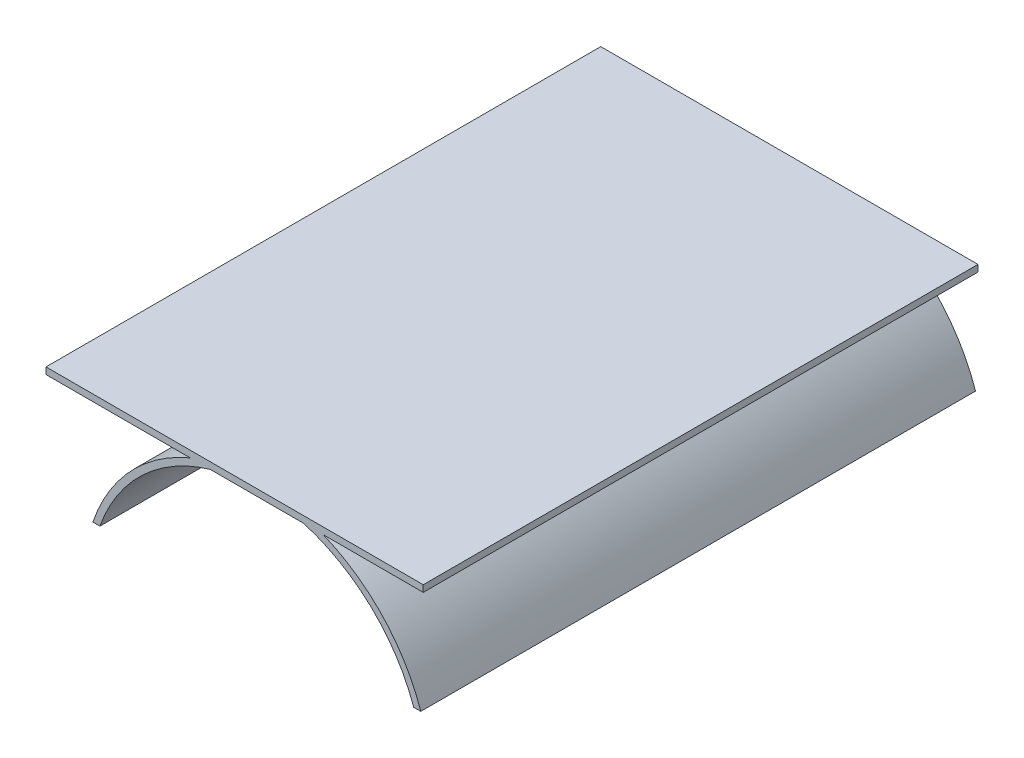
ISO-10303-21;
HEADER;
FILE_DESCRIPTION(('STEP AP214'),'2;1');
FILE_NAME('part.step','',(''),(''),'','','');
FILE_SCHEMA(('AUTOMOTIVE_DESIGN { 1 0 10303 214 1 1 1 1 }'));
ENDSEC;
DATA;
#1=APPLICATION_CONTEXT('core data for automotive mechanical design processes');
#2=APPLICATION_PROTOCOL_DEFINITION('international standard','automotive_design',2000,#1);
#3=PRODUCT_CONTEXT('',#1,'mechanical');
#4=PRODUCT('Part','Part','',(#3));
#5=PRODUCT_RELATED_PRODUCT_CATEGORY('part','',(#4));
#6=PRODUCT_DEFINITION_FORMATION('','',#4);
#7=PRODUCT_DEFINITION_CONTEXT('part definition',#1,'design');
#8=PRODUCT_DEFINITION('design','',#6,#7);
#9=PRODUCT_DEFINITION_SHAPE('','',#8);
#10=(LENGTH_UNIT() NAMED_UNIT(*) SI_UNIT(.MILLI.,.METRE.));
#11=(NAMED_UNIT(*) PLANE_ANGLE_UNIT() SI_UNIT($,.RADIAN.));
#12=(NAMED_UNIT(*) SI_UNIT($,.STERADIAN.) SOLID_ANGLE_UNIT());
#13=UNCERTAINTY_MEASURE_WITH_UNIT(LENGTH_MEASURE(1.E-05),#10,'distance_accuracy_value','');
#14=(GEOMETRIC_REPRESENTATION_CONTEXT(3) GLOBAL_UNCERTAINTY_ASSIGNED_CONTEXT((#13)) GLOBAL_UNIT_ASSIGNED_CONTEXT((#10,
#11,#12)) REPRESENTATION_CONTEXT('',''));
#15=CARTESIAN_POINT('',(0.,0.,0.));
#16=DIRECTION('',(0.,0.,1.));
#17=DIRECTION('',(1.,0.,0.));
#18=AXIS2_PLACEMENT_3D('',#15,#16,#17);
#19=CARTESIAN_POINT('',(0.,0.,250.));
#20=DIRECTION('',(0.,1.,0.));
#21=DIRECTION('',(0.,0.,1.));
#22=AXIS2_PLACEMENT_3D('',#19,#20,#21);
#23=PLANE('',#22);
#24=DIRECTION('',(0.,0.,1.));
#25=VECTOR('',#24,1.);
#26=CARTESIAN_POINT('',(73.9999999999998,0.,0.));
#27=LINE('',#26,#25);
#28=CARTESIAN_POINT('',(73.9999999999998,0.,0.));
#29=VERTEX_POINT('',#28);
#30=CARTESIAN_POINT('',(73.9999999999999,0.,250.));
#31=VERTEX_POINT('',#30);
#32=EDGE_CURVE('E275',#29,#31,#27,.T.);
#33=ORIENTED_EDGE('',*,*,#32,.F.);
#34=DIRECTION('',(1.,0.,0.));
#35=VECTOR('',#34,1.);
#36=CARTESIAN_POINT('',(0.,0.,0.));
#37=LINE('',#36,#35);
#38=CARTESIAN_POINT('',(116.,0.,0.));
#39=VERTEX_POINT('',#38);
#40=EDGE_CURVE('E230',#29,#39,#37,.T.);
#41=ORIENTED_EDGE('',*,*,#40,.T.);
#42=DIRECTION('',(0.,0.,1.));
#43=VECTOR('',#42,1.);
#44=CARTESIAN_POINT('',(116.,0.,0.));
#45=LINE('',#44,#43);
#46=CARTESIAN_POINT('',(116.,0.,250.));
#47=VERTEX_POINT('',#46);
#48=EDGE_CURVE('E200',#39,#47,#45,.T.);
#49=ORIENTED_EDGE('',*,*,#48,.T.);
#50=DIRECTION('',(1.,0.,0.));
#51=VECTOR('',#50,1.);
#52=CARTESIAN_POINT('',(0.,0.,250.));
#53=LINE('',#52,#51);
#54=EDGE_CURVE('E58',#31,#47,#53,.T.);
#55=ORIENTED_EDGE('',*,*,#54,.F.);
#56=EDGE_LOOP('',(#33,#41,#49,#55));
#57=FACE_BOUND('',#56,.T.);
#58=ADVANCED_FACE('F42',(#57),#23,.F.);
#59=DIRECTION('',(0.,0.,1.));
#60=VECTOR('',#59,1.);
#61=CARTESIAN_POINT('',(125.,0.,0.));
#62=LINE('',#61,#60);
#63=CARTESIAN_POINT('',(125.,0.,0.));
#64=VERTEX_POINT('',#63);
#65=CARTESIAN_POINT('',(125.,0.,250.));
#66=VERTEX_POINT('',#65);
#67=EDGE_CURVE('E203',#64,#66,#62,.T.);
#68=ORIENTED_EDGE('',*,*,#67,.F.);
#69=CARTESIAN_POINT('',(170.,0.,0.));
#70=VERTEX_POINT('',#69);
#71=EDGE_CURVE('E225',#64,#70,#37,.T.);
#72=ORIENTED_EDGE('',*,*,#71,.T.);
#73=DIRECTION('',(0.,0.,-1.));
#74=VECTOR('',#73,1.);
#75=CARTESIAN_POINT('',(170.,0.,250.));
#76=LINE('',#75,#74);
#77=CARTESIAN_POINT('',(170.,0.,250.));
#78=VERTEX_POINT('',#77);
#79=EDGE_CURVE('E51',#78,#70,#76,.T.);
#80=ORIENTED_EDGE('',*,*,#79,.F.);
#81=EDGE_CURVE('E211',#66,#78,#53,.T.);
#82=ORIENTED_EDGE('',*,*,#81,.F.);
#83=EDGE_LOOP('',(#68,#72,#80,#82));
#84=FACE_BOUND('',#83,.T.);
#85=ADVANCED_FACE('F283',(#84),#23,.F.);
#86=CARTESIAN_POINT('',(0.,0.,250.));
#87=DIRECTION('',(1.,0.,0.));
#88=DIRECTION('',(0.,0.,-1.));
#89=AXIS2_PLACEMENT_3D('',#86,#87,#88);
#90=PLANE('',#89);
#91=DIRECTION('',(0.,-1.,0.));
#92=VECTOR('',#91,1.);
#93=CARTESIAN_POINT('',(0.,0.,0.));
#94=LINE('',#93,#92);
#95=CARTESIAN_POINT('',(0.,3.,0.));
#96=VERTEX_POINT('',#95);
#97=CARTESIAN_POINT('',(0.,0.,0.));
#98=VERTEX_POINT('',#97);
#99=EDGE_CURVE('E199',#96,#98,#94,.T.);
#100=ORIENTED_EDGE('',*,*,#99,.T.);
#101=DIRECTION('',(0.,0.,-1.));
#102=VECTOR('',#101,1.);
#103=CARTESIAN_POINT('',(0.,0.,250.));
#104=LINE('',#103,#102);
#105=CARTESIAN_POINT('',(0.,0.,250.));
#106=VERTEX_POINT('',#105);
#107=EDGE_CURVE('E11',#106,#98,#104,.T.);
#108=ORIENTED_EDGE('',*,*,#107,.F.);
#109=DIRECTION('',(0.,-1.,0.));
#110=VECTOR('',#109,1.);
#111=CARTESIAN_POINT('',(0.,0.,250.));
#112=LINE('',#111,#110);
#113=CARTESIAN_POINT('',(0.,3.,250.));
#114=VERTEX_POINT('',#113);
#115=EDGE_CURVE('E208',#114,#106,#112,.T.);
#116=ORIENTED_EDGE('',*,*,#115,.F.);
#117=DIRECTION('',(0.,0.,-1.));
#118=VECTOR('',#117,1.);
#119=CARTESIAN_POINT('',(0.,3.,250.));
#120=LINE('',#119,#118);
#121=EDGE_CURVE('E221',#114,#96,#120,.T.);
#122=ORIENTED_EDGE('',*,*,#121,.T.);
#123=EDGE_LOOP('',(#100,#108,#116,#122));
#124=FACE_BOUND('',#123,.T.);
#125=ADVANCED_FACE('F44',(#124),#90,.F.);
#126=CARTESIAN_POINT('',(65.,0.,0.));
#127=VERTEX_POINT('',#126);
#128=EDGE_CURVE('E226',#98,#127,#37,.T.);
#129=ORIENTED_EDGE('',*,*,#128,.T.);
#130=DIRECTION('',(0.,0.,1.));
#131=VECTOR('',#130,1.);
#132=CARTESIAN_POINT('',(65.,0.,0.));
#133=LINE('',#132,#131);
#134=CARTESIAN_POINT('',(65.,0.,250.));
#135=VERTEX_POINT('',#134);
#136=EDGE_CURVE('E66',#127,#135,#133,.T.);
#137=ORIENTED_EDGE('',*,*,#136,.T.);
#138=EDGE_CURVE('E157',#106,#135,#53,.T.);
#139=ORIENTED_EDGE('',*,*,#138,.F.);
#140=ORIENTED_EDGE('',*,*,#107,.T.);
#141=EDGE_LOOP('',(#129,#137,#139,#140));
#142=FACE_BOUND('',#141,.T.);
#143=ADVANCED_FACE('F286',(#142),#23,.F.);
#144=CARTESIAN_POINT('',(170.,0.,250.));
#145=DIRECTION('',(-1.,0.,0.));
#146=DIRECTION('',(0.,0.,1.));
#147=AXIS2_PLACEMENT_3D('',#144,#145,#146);
#148=PLANE('',#147);
#149=DIRECTION('',(0.,1.,0.));
#150=VECTOR('',#149,1.);
#151=CARTESIAN_POINT('',(170.,0.,0.));
#152=LINE('',#151,#150);
#153=CARTESIAN_POINT('',(170.,3.,0.));
#154=VERTEX_POINT('',#153);
#155=EDGE_CURVE('E229',#70,#154,#152,.T.);
#156=ORIENTED_EDGE('',*,*,#155,.T.);
#157=DIRECTION('',(0.,0.,-1.));
#158=VECTOR('',#157,1.);
#159=CARTESIAN_POINT('',(170.,3.,250.));
#160=LINE('',#159,#158);
#161=CARTESIAN_POINT('',(170.,3.,250.));
#162=VERTEX_POINT('',#161);
#163=EDGE_CURVE('E238',#162,#154,#160,.T.);
#164=ORIENTED_EDGE('',*,*,#163,.F.);
#165=DIRECTION('',(0.,1.,0.));
#166=VECTOR('',#165,1.);
#167=CARTESIAN_POINT('',(170.,0.,250.));
#168=LINE('',#167,#166);
#169=EDGE_CURVE('E215',#78,#162,#168,.T.);
#170=ORIENTED_EDGE('',*,*,#169,.F.);
#171=ORIENTED_EDGE('',*,*,#79,.T.);
#172=EDGE_LOOP('',(#156,#164,#170,#171));
#173=FACE_BOUND('',#172,.T.);
#174=ADVANCED_FACE('F247',(#173),#148,.F.);
#175=CARTESIAN_POINT('',(0.,3.,250.));
#176=DIRECTION('',(0.,-1.,0.));
#177=DIRECTION('',(0.,0.,-1.));
#178=AXIS2_PLACEMENT_3D('',#175,#176,#177);
#179=PLANE('',#178);
#180=DIRECTION('',(-1.,0.,0.));
#181=VECTOR('',#180,1.);
#182=CARTESIAN_POINT('',(0.,3.,0.));
#183=LINE('',#182,#181);
#184=EDGE_CURVE('E212',#154,#96,#183,.T.);
#185=ORIENTED_EDGE('',*,*,#184,.T.);
#186=ORIENTED_EDGE('',*,*,#121,.F.);
#187=DIRECTION('',(-1.,0.,0.));
#188=VECTOR('',#187,1.);
#189=CARTESIAN_POINT('',(0.,3.,250.));
#190=LINE('',#189,#188);
#191=EDGE_CURVE('E218',#162,#114,#190,.T.);
#192=ORIENTED_EDGE('',*,*,#191,.F.);
#193=ORIENTED_EDGE('',*,*,#163,.T.);
#194=EDGE_LOOP('',(#185,#186,#192,#193));
#195=FACE_BOUND('',#194,.T.);
#196=ADVANCED_FACE('F259',(#195),#179,.F.);
#197=CARTESIAN_POINT('',(0.,0.,250.));
#198=DIRECTION('',(0.,0.,-1.));
#199=DIRECTION('',(-1.,0.,0.));
#200=AXIS2_PLACEMENT_3D('',#197,#198,#199);
#201=PLANE('',#200);
#202=ORIENTED_EDGE('',*,*,#115,.T.);
#203=ORIENTED_EDGE('',*,*,#138,.T.);
#204=CARTESIAN_POINT('',(95.,-72.,250.));
#205=DIRECTION('',(0.,0.,1.));
#206=DIRECTION('',(1.,0.,0.));
#207=AXIS2_PLACEMENT_3D('',#204,#205,#206);
#208=CIRCLE('',#207,78.);
#209=CARTESIAN_POINT('',(21.1149541517365,-47.,250.));
#210=VERTEX_POINT('',#209);
#211=EDGE_CURVE('E137',#135,#210,#208,.T.);
#212=ORIENTED_EDGE('',*,*,#211,.T.);
#213=DIRECTION('',(1.,0.,0.));
#214=VECTOR('',#213,1.);
#215=CARTESIAN_POINT('',(21.1149541517365,-47.,250.));
#216=LINE('',#215,#214);
#217=CARTESIAN_POINT('',(24.2893218813452,-47.,250.));
#218=VERTEX_POINT('',#217);
#219=EDGE_CURVE('E147',#210,#218,#216,.T.);
#220=ORIENTED_EDGE('',*,*,#219,.T.);
#221=CARTESIAN_POINT('',(95.,-72.,250.));
#222=DIRECTION('',(0.,0.,1.));
#223=DIRECTION('',(1.,0.,0.));
#224=AXIS2_PLACEMENT_3D('',#221,#222,#223);
#225=CIRCLE('',#224,75.);
#226=EDGE_CURVE('E153',#31,#218,#225,.T.);
#227=ORIENTED_EDGE('',*,*,#226,.F.);
#228=ORIENTED_EDGE('',*,*,#54,.T.);
#229=CARTESIAN_POINT('',(95.,-72.,250.));
#230=DIRECTION('',(0.,0.,1.));
#231=DIRECTION('',(1.,0.,0.));
#232=AXIS2_PLACEMENT_3D('',#229,#230,#231);
#233=CIRCLE('',#232,75.);
#234=CARTESIAN_POINT('',(165.710678118655,-47.,250.));
#235=VERTEX_POINT('',#234);
#236=EDGE_CURVE('E178',#235,#47,#233,.T.);
#237=ORIENTED_EDGE('',*,*,#236,.F.);
#238=DIRECTION('',(1.,0.,0.));
#239=VECTOR('',#238,1.);
#240=CARTESIAN_POINT('',(165.710678118655,-47.,250.));
#241=LINE('',#240,#239);
#242=CARTESIAN_POINT('',(168.885045848264,-47.,250.));
#243=VERTEX_POINT('',#242);
#244=EDGE_CURVE('E168',#235,#243,#241,.T.);
#245=ORIENTED_EDGE('',*,*,#244,.T.);
#246=CARTESIAN_POINT('',(95.,-72.,250.));
#247=DIRECTION('',(0.,0.,1.));
#248=DIRECTION('',(1.,0.,0.));
#249=AXIS2_PLACEMENT_3D('',#246,#247,#248);
#250=CIRCLE('',#249,78.);
#251=EDGE_CURVE('E189',#243,#66,#250,.T.);
#252=ORIENTED_EDGE('',*,*,#251,.T.);
#253=ORIENTED_EDGE('',*,*,#81,.T.);
#254=ORIENTED_EDGE('',*,*,#169,.T.);
#255=ORIENTED_EDGE('',*,*,#191,.T.);
#256=EDGE_LOOP('',(#202,#203,#212,#220,#227,#228,#237,#245,#252,#253,#254,#255));
#257=FACE_BOUND('',#256,.T.);
#258=ADVANCED_FACE('F156',(#257),#201,.F.);
#259=CARTESIAN_POINT('',(0.,0.,0.));
#260=DIRECTION('',(0.,0.,-1.));
#261=DIRECTION('',(-1.,0.,0.));
#262=AXIS2_PLACEMENT_3D('',#259,#260,#261);
#263=PLANE('',#262);
#264=ORIENTED_EDGE('',*,*,#99,.F.);
#265=ORIENTED_EDGE('',*,*,#184,.F.);
#266=ORIENTED_EDGE('',*,*,#155,.F.);
#267=ORIENTED_EDGE('',*,*,#71,.F.);
#268=CARTESIAN_POINT('',(95.,-72.,0.));
#269=DIRECTION('',(0.,0.,1.));
#270=DIRECTION('',(1.,0.,0.));
#271=AXIS2_PLACEMENT_3D('',#268,#269,#270);
#272=CIRCLE('',#271,78.);
#273=CARTESIAN_POINT('',(168.885045848264,-47.,0.));
#274=VERTEX_POINT('',#273);
#275=EDGE_CURVE('E177',#274,#64,#272,.T.);
#276=ORIENTED_EDGE('',*,*,#275,.F.);
#277=DIRECTION('',(1.,0.,0.));
#278=VECTOR('',#277,1.);
#279=CARTESIAN_POINT('',(165.710678118655,-47.,0.));
#280=LINE('',#279,#278);
#281=CARTESIAN_POINT('',(165.710678118655,-47.,0.));
#282=VERTEX_POINT('',#281);
#283=EDGE_CURVE('E173',#282,#274,#280,.T.);
#284=ORIENTED_EDGE('',*,*,#283,.F.);
#285=CARTESIAN_POINT('',(95.,-72.,0.));
#286=DIRECTION('',(0.,0.,1.));
#287=DIRECTION('',(1.,0.,0.));
#288=AXIS2_PLACEMENT_3D('',#285,#286,#287);
#289=CIRCLE('',#288,75.);
#290=EDGE_CURVE('E181',#282,#39,#289,.T.);
#291=ORIENTED_EDGE('',*,*,#290,.T.);
#292=ORIENTED_EDGE('',*,*,#40,.F.);
#293=CARTESIAN_POINT('',(95.,-72.,0.));
#294=DIRECTION('',(0.,0.,1.));
#295=DIRECTION('',(1.,0.,0.));
#296=AXIS2_PLACEMENT_3D('',#293,#294,#295);
#297=CIRCLE('',#296,75.);
#298=CARTESIAN_POINT('',(24.2893218813452,-47.,0.));
#299=VERTEX_POINT('',#298);
#300=EDGE_CURVE('E159',#29,#299,#297,.T.);
#301=ORIENTED_EDGE('',*,*,#300,.T.);
#302=DIRECTION('',(1.,0.,0.));
#303=VECTOR('',#302,1.);
#304=CARTESIAN_POINT('',(21.1149541517365,-47.,0.));
#305=LINE('',#304,#303);
#306=CARTESIAN_POINT('',(21.1149541517365,-47.,0.));
#307=VERTEX_POINT('',#306);
#308=EDGE_CURVE('E162',#307,#299,#305,.T.);
#309=ORIENTED_EDGE('',*,*,#308,.F.);
#310=CARTESIAN_POINT('',(95.,-72.,0.));
#311=DIRECTION('',(0.,0.,1.));
#312=DIRECTION('',(1.,0.,0.));
#313=AXIS2_PLACEMENT_3D('',#310,#311,#312);
#314=CIRCLE('',#313,78.);
#315=EDGE_CURVE('E139',#127,#307,#314,.T.);
#316=ORIENTED_EDGE('',*,*,#315,.F.);
#317=ORIENTED_EDGE('',*,*,#128,.F.);
#318=EDGE_LOOP('',(#264,#265,#266,#267,#276,#284,#291,#292,#301,#309,#316,#317));
#319=FACE_BOUND('',#318,.T.);
#320=ADVANCED_FACE('F255',(#319),#263,.T.);
#321=CARTESIAN_POINT('',(165.710678118655,-47.,0.));
#322=DIRECTION('',(0.,-1.,0.));
#323=DIRECTION('',(1.,0.,0.));
#324=AXIS2_PLACEMENT_3D('',#321,#322,#323);
#325=PLANE('',#324);
#326=ORIENTED_EDGE('',*,*,#244,.F.);
#327=DIRECTION('',(0.,0.,1.));
#328=VECTOR('',#327,1.);
#329=CARTESIAN_POINT('',(165.710678118655,-47.,0.));
#330=LINE('',#329,#328);
#331=EDGE_CURVE('E196',#282,#235,#330,.T.);
#332=ORIENTED_EDGE('',*,*,#331,.F.);
#333=ORIENTED_EDGE('',*,*,#283,.T.);
#334=DIRECTION('',(0.,0.,1.));
#335=VECTOR('',#334,1.);
#336=CARTESIAN_POINT('',(168.885045848264,-47.,0.));
#337=LINE('',#336,#335);
#338=EDGE_CURVE('E185',#274,#243,#337,.T.);
#339=ORIENTED_EDGE('',*,*,#338,.T.);
#340=EDGE_LOOP('',(#326,#332,#333,#339));
#341=FACE_BOUND('',#340,.T.);
#342=ADVANCED_FACE('F280',(#341),#325,.T.);
#343=CARTESIAN_POINT('',(95.,-72.,0.));
#344=DIRECTION('',(0.,0.,1.));
#345=DIRECTION('',(1.,0.,0.));
#346=AXIS2_PLACEMENT_3D('',#343,#344,#345);
#347=CYLINDRICAL_SURFACE('',#346,75.);
#348=ORIENTED_EDGE('',*,*,#236,.T.);
#349=ORIENTED_EDGE('',*,*,#48,.F.);
#350=ORIENTED_EDGE('',*,*,#290,.F.);
#351=ORIENTED_EDGE('',*,*,#331,.T.);
#352=EDGE_LOOP('',(#348,#349,#350,#351));
#353=FACE_BOUND('',#352,.T.);
#354=ADVANCED_FACE('F273',(#353),#347,.F.);
#355=CARTESIAN_POINT('',(95.,-72.,0.));
#356=DIRECTION('',(0.,0.,1.));
#357=DIRECTION('',(1.,0.,0.));
#358=AXIS2_PLACEMENT_3D('',#355,#356,#357);
#359=CYLINDRICAL_SURFACE('',#358,78.);
#360=ORIENTED_EDGE('',*,*,#251,.F.);
#361=ORIENTED_EDGE('',*,*,#338,.F.);
#362=ORIENTED_EDGE('',*,*,#275,.T.);
#363=ORIENTED_EDGE('',*,*,#67,.T.);
#364=EDGE_LOOP('',(#360,#361,#362,#363));
#365=FACE_BOUND('',#364,.T.);
#366=ADVANCED_FACE('F282',(#365),#359,.T.);
#367=CARTESIAN_POINT('',(95.,-72.,0.));
#368=DIRECTION('',(0.,0.,1.));
#369=DIRECTION('',(1.,0.,0.));
#370=AXIS2_PLACEMENT_3D('',#367,#368,#369);
#371=CYLINDRICAL_SURFACE('',#370,75.);
#372=ORIENTED_EDGE('',*,*,#226,.T.);
#373=DIRECTION('',(0.,0.,1.));
#374=VECTOR('',#373,1.);
#375=CARTESIAN_POINT('',(24.2893218813452,-47.,0.));
#376=LINE('',#375,#374);
#377=EDGE_CURVE('E144',#299,#218,#376,.T.);
#378=ORIENTED_EDGE('',*,*,#377,.F.);
#379=ORIENTED_EDGE('',*,*,#300,.F.);
#380=ORIENTED_EDGE('',*,*,#32,.T.);
#381=EDGE_LOOP('',(#372,#378,#379,#380));
#382=FACE_BOUND('',#381,.T.);
#383=ADVANCED_FACE('F298',(#382),#371,.F.);
#384=CARTESIAN_POINT('',(21.1149541517365,-47.,0.));
#385=DIRECTION('',(0.,-1.,0.));
#386=DIRECTION('',(1.,0.,0.));
#387=AXIS2_PLACEMENT_3D('',#384,#385,#386);
#388=PLANE('',#387);
#389=ORIENTED_EDGE('',*,*,#219,.F.);
#390=DIRECTION('',(0.,0.,1.));
#391=VECTOR('',#390,1.);
#392=CARTESIAN_POINT('',(21.1149541517365,-47.,0.));
#393=LINE('',#392,#391);
#394=EDGE_CURVE('E133',#307,#210,#393,.T.);
#395=ORIENTED_EDGE('',*,*,#394,.F.);
#396=ORIENTED_EDGE('',*,*,#308,.T.);
#397=ORIENTED_EDGE('',*,*,#377,.T.);
#398=EDGE_LOOP('',(#389,#395,#396,#397));
#399=FACE_BOUND('',#398,.T.);
#400=ADVANCED_FACE('F148',(#399),#388,.T.);
#401=CARTESIAN_POINT('',(95.,-72.,0.));
#402=DIRECTION('',(0.,0.,1.));
#403=DIRECTION('',(1.,0.,0.));
#404=AXIS2_PLACEMENT_3D('',#401,#402,#403);
#405=CYLINDRICAL_SURFACE('',#404,78.);
#406=ORIENTED_EDGE('',*,*,#211,.F.);
#407=ORIENTED_EDGE('',*,*,#136,.F.);
#408=ORIENTED_EDGE('',*,*,#315,.T.);
#409=ORIENTED_EDGE('',*,*,#394,.T.);
#410=EDGE_LOOP('',(#406,#407,#408,#409));
#411=FACE_BOUND('',#410,.T.);
#412=ADVANCED_FACE('F135',(#411),#405,.T.);
#413=CLOSED_SHELL('',(#58,#85,#125,#143,#174,#196,#258,#320,#342,#354,#366,#383,#400,#412));
#414=MANIFOLD_SOLID_BREP('B2',#413);
#415=ADVANCED_BREP_SHAPE_REPRESENTATION('',(#18,#414),#14);
#416=SHAPE_DEFINITION_REPRESENTATION(#9,#415);
ENDSEC;
END-ISO-10303-21;
